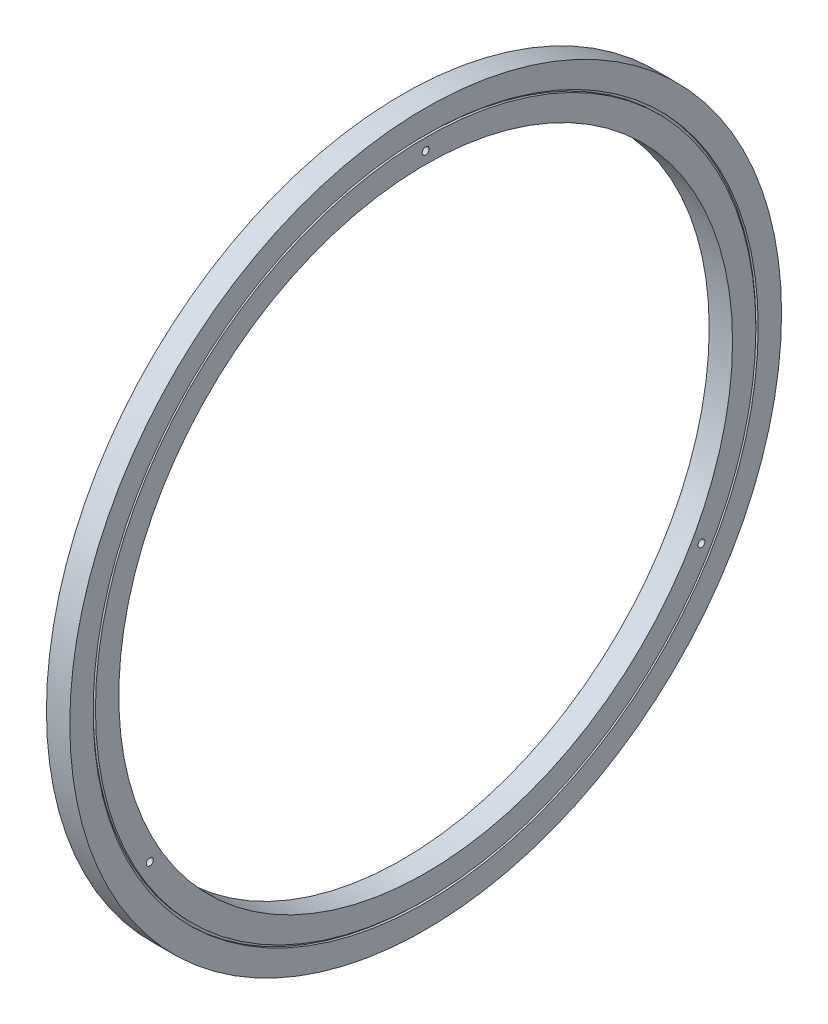
ISO-10303-21;
HEADER;
FILE_DESCRIPTION(('STEP AP214'),'2;1');
FILE_NAME('part.step','',(''),(''),'','','');
FILE_SCHEMA(('AUTOMOTIVE_DESIGN { 1 0 10303 214 1 1 1 1 }'));
ENDSEC;
DATA;
#1=APPLICATION_CONTEXT('core data for automotive mechanical design processes');
#2=APPLICATION_PROTOCOL_DEFINITION('international standard','automotive_design',2000,#1);
#3=PRODUCT_CONTEXT('',#1,'mechanical');
#4=PRODUCT('Part','Part','',(#3));
#5=PRODUCT_RELATED_PRODUCT_CATEGORY('part','',(#4));
#6=PRODUCT_DEFINITION_FORMATION('','',#4);
#7=PRODUCT_DEFINITION_CONTEXT('part definition',#1,'design');
#8=PRODUCT_DEFINITION('design','',#6,#7);
#9=PRODUCT_DEFINITION_SHAPE('','',#8);
#10=(LENGTH_UNIT() NAMED_UNIT(*) SI_UNIT(.MILLI.,.METRE.));
#11=(NAMED_UNIT(*) PLANE_ANGLE_UNIT() SI_UNIT($,.RADIAN.));
#12=(NAMED_UNIT(*) SI_UNIT($,.STERADIAN.) SOLID_ANGLE_UNIT());
#13=UNCERTAINTY_MEASURE_WITH_UNIT(LENGTH_MEASURE(1.E-05),#10,'distance_accuracy_value','');
#14=(GEOMETRIC_REPRESENTATION_CONTEXT(3) GLOBAL_UNCERTAINTY_ASSIGNED_CONTEXT((#13)) GLOBAL_UNIT_ASSIGNED_CONTEXT((#10,
#11,#12)) REPRESENTATION_CONTEXT('',''));
#15=CARTESIAN_POINT('',(0.,0.,0.));
#16=DIRECTION('',(0.,0.,1.));
#17=DIRECTION('',(1.,0.,0.));
#18=AXIS2_PLACEMENT_3D('',#15,#16,#17);
#19=CARTESIAN_POINT('',(5.,0.,0.));
#20=DIRECTION('',(-1.,0.,0.));
#21=DIRECTION('',(0.,0.,1.));
#22=AXIS2_PLACEMENT_3D('',#19,#20,#21);
#23=CYLINDRICAL_SURFACE('',#22,141.5);
#24=CARTESIAN_POINT('',(-5.,0.,0.));
#25=DIRECTION('',(1.,0.,0.));
#26=DIRECTION('',(0.,0.,-1.));
#27=AXIS2_PLACEMENT_3D('',#24,#25,#26);
#28=CIRCLE('',#27,141.5);
#29=CARTESIAN_POINT('',(-5.,0.,-141.5));
#30=VERTEX_POINT('',#29);
#31=EDGE_CURVE('E66',#30,#30,#28,.T.);
#32=ORIENTED_EDGE('',*,*,#31,.T.);
#33=EDGE_LOOP('',(#32));
#34=FACE_BOUND('',#33,.T.);
#35=CARTESIAN_POINT('',(-4.,0.,0.));
#36=DIRECTION('',(1.,0.,0.));
#37=DIRECTION('',(0.,0.,-1.));
#38=AXIS2_PLACEMENT_3D('',#35,#36,#37);
#39=CIRCLE('',#38,141.5);
#40=CARTESIAN_POINT('',(-4.,0.,-141.5));
#41=VERTEX_POINT('',#40);
#42=EDGE_CURVE('E11',#41,#41,#39,.T.);
#43=ORIENTED_EDGE('',*,*,#42,.F.);
#44=EDGE_LOOP('',(#43));
#45=FACE_BOUND('',#44,.T.);
#46=ADVANCED_FACE('F47',(#34,#45),#23,.T.);
#47=CARTESIAN_POINT('',(5.,0.,0.));
#48=DIRECTION('',(-1.,0.,0.));
#49=DIRECTION('',(0.,0.,1.));
#50=AXIS2_PLACEMENT_3D('',#47,#48,#49);
#51=CYLINDRICAL_SURFACE('',#50,131.5);
#52=CARTESIAN_POINT('',(5.,0.,0.));
#53=DIRECTION('',(1.,0.,0.));
#54=DIRECTION('',(0.,0.,-1.));
#55=AXIS2_PLACEMENT_3D('',#52,#53,#54);
#56=CIRCLE('',#55,131.5);
#57=CARTESIAN_POINT('',(5.,0.,-131.5));
#58=VERTEX_POINT('',#57);
#59=EDGE_CURVE('E60',#58,#58,#56,.T.);
#60=ORIENTED_EDGE('',*,*,#59,.T.);
#61=EDGE_LOOP('',(#60));
#62=FACE_BOUND('',#61,.T.);
#63=CARTESIAN_POINT('',(-5.,0.,0.));
#64=DIRECTION('',(1.,0.,0.));
#65=DIRECTION('',(0.,0.,-1.));
#66=AXIS2_PLACEMENT_3D('',#63,#64,#65);
#67=CIRCLE('',#66,131.5);
#68=CARTESIAN_POINT('',(-5.,0.,-131.5));
#69=VERTEX_POINT('',#68);
#70=EDGE_CURVE('E70',#69,#69,#67,.T.);
#71=ORIENTED_EDGE('',*,*,#70,.F.);
#72=EDGE_LOOP('',(#71));
#73=FACE_BOUND('',#72,.T.);
#74=ADVANCED_FACE('F49',(#62,#73),#51,.F.);
#75=CARTESIAN_POINT('',(4.,0.,0.));
#76=DIRECTION('',(1.,0.,0.));
#77=DIRECTION('',(0.,0.,-1.));
#78=AXIS2_PLACEMENT_3D('',#75,#76,#77);
#79=CIRCLE('',#78,141.5);
#80=CARTESIAN_POINT('',(4.,0.,-141.5));
#81=VERTEX_POINT('',#80);
#82=EDGE_CURVE('E73',#81,#81,#79,.T.);
#83=ORIENTED_EDGE('',*,*,#82,.T.);
#84=EDGE_LOOP('',(#83));
#85=FACE_BOUND('',#84,.T.);
#86=CARTESIAN_POINT('',(5.,0.,0.));
#87=DIRECTION('',(1.,0.,0.));
#88=DIRECTION('',(0.,0.,-1.));
#89=AXIS2_PLACEMENT_3D('',#86,#87,#88);
#90=CIRCLE('',#89,141.5);
#91=CARTESIAN_POINT('',(5.,0.,-141.5));
#92=VERTEX_POINT('',#91);
#93=EDGE_CURVE('E55',#92,#92,#90,.T.);
#94=ORIENTED_EDGE('',*,*,#93,.F.);
#95=EDGE_LOOP('',(#94));
#96=FACE_BOUND('',#95,.T.);
#97=ADVANCED_FACE('F93',(#85,#96),#23,.T.);
#98=CARTESIAN_POINT('',(5.,0.,0.));
#99=DIRECTION('',(1.,0.,0.));
#100=DIRECTION('',(0.,0.,-1.));
#101=AXIS2_PLACEMENT_3D('',#98,#99,#100);
#102=PLANE('',#101);
#103=CARTESIAN_POINT('',(5.,136.499999999995,-9.41439097620191E-12));
#104=DIRECTION('',(1.,0.,0.));
#105=DIRECTION('',(0.,0.,-1.));
#106=AXIS2_PLACEMENT_3D('',#103,#104,#105);
#107=CIRCLE('',#106,1.49999999999246);
#108=CARTESIAN_POINT('',(5.,136.499999999995,-1.50000000000187));
#109=VERTEX_POINT('',#108);
#110=EDGE_CURVE('E151',#109,#109,#107,.T.);
#111=ORIENTED_EDGE('',*,*,#110,.F.);
#112=EDGE_LOOP('',(#111));
#113=FACE_BOUND('',#112,.T.);
#114=CARTESIAN_POINT('',(5.,-68.2500000000005,-118.212467616576));
#115=DIRECTION('',(1.,0.,0.));
#116=DIRECTION('',(0.,0.,-1.));
#117=AXIS2_PLACEMENT_3D('',#114,#115,#116);
#118=CIRCLE('',#117,1.50000000000002);
#119=CARTESIAN_POINT('',(5.,-68.2500000000005,-119.712467616576));
#120=VERTEX_POINT('',#119);
#121=EDGE_CURVE('E143',#120,#120,#118,.T.);
#122=ORIENTED_EDGE('',*,*,#121,.F.);
#123=EDGE_LOOP('',(#122));
#124=FACE_BOUND('',#123,.T.);
#125=CARTESIAN_POINT('',(5.,-68.2499999999944,118.212467616568));
#126=DIRECTION('',(1.,0.,0.));
#127=DIRECTION('',(0.,0.,-1.));
#128=AXIS2_PLACEMENT_3D('',#125,#126,#127);
#129=CIRCLE('',#128,1.50000000000348);
#130=CARTESIAN_POINT('',(5.,-68.2499999999944,116.712467616564));
#131=VERTEX_POINT('',#130);
#132=EDGE_CURVE('E135',#131,#131,#129,.T.);
#133=ORIENTED_EDGE('',*,*,#132,.F.);
#134=EDGE_LOOP('',(#133));
#135=FACE_BOUND('',#134,.T.);
#136=ORIENTED_EDGE('',*,*,#59,.F.);
#137=EDGE_LOOP('',(#136));
#138=FACE_BOUND('',#137,.T.);
#139=ORIENTED_EDGE('',*,*,#93,.T.);
#140=EDGE_LOOP('',(#139));
#141=FACE_BOUND('',#140,.T.);
#142=ADVANCED_FACE('F83',(#113,#124,#135,#138,#141),#102,.T.);
#143=CARTESIAN_POINT('',(-5.,0.,0.));
#144=DIRECTION('',(1.,0.,0.));
#145=DIRECTION('',(0.,0.,-1.));
#146=AXIS2_PLACEMENT_3D('',#143,#144,#145);
#147=PLANE('',#146);
#148=ORIENTED_EDGE('',*,*,#70,.T.);
#149=EDGE_LOOP('',(#148));
#150=FACE_BOUND('',#149,.T.);
#151=ORIENTED_EDGE('',*,*,#31,.F.);
#152=EDGE_LOOP('',(#151));
#153=FACE_BOUND('',#152,.T.);
#154=ADVANCED_FACE('F80',(#150,#153),#147,.F.);
#155=CARTESIAN_POINT('',(4.,0.,0.));
#156=DIRECTION('',(1.,0.,0.));
#157=DIRECTION('',(0.,0.,-1.));
#158=AXIS2_PLACEMENT_3D('',#155,#156,#157);
#159=PLANE('',#158);
#160=ORIENTED_EDGE('',*,*,#82,.F.);
#161=EDGE_LOOP('',(#160));
#162=FACE_BOUND('',#161,.T.);
#163=CARTESIAN_POINT('',(4.,0.,0.));
#164=DIRECTION('',(1.,0.,0.));
#165=DIRECTION('',(0.,0.,-1.));
#166=AXIS2_PLACEMENT_3D('',#163,#164,#165);
#167=CIRCLE('',#166,142.5);
#168=CARTESIAN_POINT('',(4.,0.,-142.5));
#169=VERTEX_POINT('',#168);
#170=EDGE_CURVE('E113',#169,#169,#167,.F.);
#171=ORIENTED_EDGE('',*,*,#170,.F.);
#172=EDGE_LOOP('',(#171));
#173=FACE_BOUND('',#172,.T.);
#174=ADVANCED_FACE('F82',(#162,#173),#159,.T.);
#175=CARTESIAN_POINT('',(-4.,0.,0.));
#176=DIRECTION('',(1.,0.,0.));
#177=DIRECTION('',(0.,0.,-1.));
#178=AXIS2_PLACEMENT_3D('',#175,#176,#177);
#179=PLANE('',#178);
#180=ORIENTED_EDGE('',*,*,#42,.T.);
#181=EDGE_LOOP('',(#180));
#182=FACE_BOUND('',#181,.T.);
#183=CARTESIAN_POINT('',(-4.,0.,0.));
#184=DIRECTION('',(1.,0.,0.));
#185=DIRECTION('',(0.,0.,-1.));
#186=AXIS2_PLACEMENT_3D('',#183,#184,#185);
#187=CIRCLE('',#186,142.5);
#188=CARTESIAN_POINT('',(-4.,0.,-142.5));
#189=VERTEX_POINT('',#188);
#190=EDGE_CURVE('E109',#189,#189,#187,.T.);
#191=ORIENTED_EDGE('',*,*,#190,.F.);
#192=EDGE_LOOP('',(#191));
#193=FACE_BOUND('',#192,.T.);
#194=ADVANCED_FACE('F90',(#182,#193),#179,.F.);
#195=CARTESIAN_POINT('',(5.,0.,0.));
#196=DIRECTION('',(-1.,0.,0.));
#197=DIRECTION('',(0.,0.,1.));
#198=AXIS2_PLACEMENT_3D('',#195,#196,#197);
#199=CYLINDRICAL_SURFACE('',#198,142.5);
#200=CARTESIAN_POINT('',(-5.,0.,0.));
#201=DIRECTION('',(1.,0.,0.));
#202=DIRECTION('',(0.,0.,-1.));
#203=AXIS2_PLACEMENT_3D('',#200,#201,#202);
#204=CIRCLE('',#203,142.5);
#205=CARTESIAN_POINT('',(-5.,0.,-142.5));
#206=VERTEX_POINT('',#205);
#207=EDGE_CURVE('E124',#206,#206,#204,.T.);
#208=ORIENTED_EDGE('',*,*,#207,.F.);
#209=EDGE_LOOP('',(#208));
#210=FACE_BOUND('',#209,.T.);
#211=ORIENTED_EDGE('',*,*,#190,.T.);
#212=EDGE_LOOP('',(#211));
#213=FACE_BOUND('',#212,.T.);
#214=ADVANCED_FACE('F204',(#210,#213),#199,.F.);
#215=ORIENTED_EDGE('',*,*,#170,.T.);
#216=EDGE_LOOP('',(#215));
#217=FACE_BOUND('',#216,.T.);
#218=CARTESIAN_POINT('',(5.,0.,0.));
#219=DIRECTION('',(1.,0.,0.));
#220=DIRECTION('',(0.,0.,-1.));
#221=AXIS2_PLACEMENT_3D('',#218,#219,#220);
#222=CIRCLE('',#221,142.5);
#223=CARTESIAN_POINT('',(5.,0.,-142.5));
#224=VERTEX_POINT('',#223);
#225=EDGE_CURVE('E123',#224,#224,#222,.T.);
#226=ORIENTED_EDGE('',*,*,#225,.T.);
#227=EDGE_LOOP('',(#226));
#228=FACE_BOUND('',#227,.T.);
#229=ADVANCED_FACE('F201',(#217,#228),#199,.F.);
#230=CARTESIAN_POINT('',(5.,0.,0.));
#231=DIRECTION('',(-1.,0.,0.));
#232=DIRECTION('',(0.,0.,1.));
#233=AXIS2_PLACEMENT_3D('',#230,#231,#232);
#234=CYLINDRICAL_SURFACE('',#233,152.5);
#235=CARTESIAN_POINT('',(5.,0.,0.));
#236=DIRECTION('',(1.,0.,0.));
#237=DIRECTION('',(0.,0.,-1.));
#238=AXIS2_PLACEMENT_3D('',#235,#236,#237);
#239=CIRCLE('',#238,152.5);
#240=CARTESIAN_POINT('',(5.,0.,-152.5));
#241=VERTEX_POINT('',#240);
#242=EDGE_CURVE('E118',#241,#241,#239,.T.);
#243=ORIENTED_EDGE('',*,*,#242,.F.);
#244=EDGE_LOOP('',(#243));
#245=FACE_BOUND('',#244,.T.);
#246=CARTESIAN_POINT('',(-5.,0.,0.));
#247=DIRECTION('',(1.,0.,0.));
#248=DIRECTION('',(0.,0.,-1.));
#249=AXIS2_PLACEMENT_3D('',#246,#247,#248);
#250=CIRCLE('',#249,152.5);
#251=CARTESIAN_POINT('',(-5.,0.,-152.5));
#252=VERTEX_POINT('',#251);
#253=EDGE_CURVE('E119',#252,#252,#250,.T.);
#254=ORIENTED_EDGE('',*,*,#253,.T.);
#255=EDGE_LOOP('',(#254));
#256=FACE_BOUND('',#255,.T.);
#257=ADVANCED_FACE('F196',(#245,#256),#234,.T.);
#258=CARTESIAN_POINT('',(5.,0.,0.));
#259=DIRECTION('',(1.,0.,0.));
#260=DIRECTION('',(0.,0.,-1.));
#261=AXIS2_PLACEMENT_3D('',#258,#259,#260);
#262=PLANE('',#261);
#263=ORIENTED_EDGE('',*,*,#225,.F.);
#264=EDGE_LOOP('',(#263));
#265=FACE_BOUND('',#264,.T.);
#266=ORIENTED_EDGE('',*,*,#242,.T.);
#267=EDGE_LOOP('',(#266));
#268=FACE_BOUND('',#267,.T.);
#269=ADVANCED_FACE('F189',(#265,#268),#262,.T.);
#270=CARTESIAN_POINT('',(-5.,0.,0.));
#271=DIRECTION('',(1.,0.,0.));
#272=DIRECTION('',(0.,0.,-1.));
#273=AXIS2_PLACEMENT_3D('',#270,#271,#272);
#274=PLANE('',#273);
#275=ORIENTED_EDGE('',*,*,#207,.T.);
#276=EDGE_LOOP('',(#275));
#277=FACE_BOUND('',#276,.T.);
#278=ORIENTED_EDGE('',*,*,#253,.F.);
#279=EDGE_LOOP('',(#278));
#280=FACE_BOUND('',#279,.T.);
#281=ADVANCED_FACE('F179',(#277,#280),#274,.F.);
#282=CARTESIAN_POINT('',(1.,-68.2499999999944,118.212467616568));
#283=DIRECTION('',(1.,0.,0.));
#284=DIRECTION('',(0.,0.,-1.));
#285=AXIS2_PLACEMENT_3D('',#282,#283,#284);
#286=CYLINDRICAL_SURFACE('',#285,1.50000000000348);
#287=CARTESIAN_POINT('',(1.,-68.2499999999944,118.212467616568));
#288=DIRECTION('',(1.,0.,0.));
#289=DIRECTION('',(0.,0.,-1.));
#290=AXIS2_PLACEMENT_3D('',#287,#288,#289);
#291=CIRCLE('',#290,1.50000000000348);
#292=CARTESIAN_POINT('',(1.,-68.2499999999944,116.712467616564));
#293=VERTEX_POINT('',#292);
#294=EDGE_CURVE('E139',#293,#293,#291,.T.);
#295=ORIENTED_EDGE('',*,*,#294,.F.);
#296=EDGE_LOOP('',(#295));
#297=FACE_BOUND('',#296,.T.);
#298=ORIENTED_EDGE('',*,*,#132,.T.);
#299=EDGE_LOOP('',(#298));
#300=FACE_BOUND('',#299,.T.);
#301=ADVANCED_FACE('F176',(#297,#300),#286,.F.);
#302=CARTESIAN_POINT('',(1.,0.,0.));
#303=DIRECTION('',(1.,0.,0.));
#304=DIRECTION('',(0.,0.,-1.));
#305=AXIS2_PLACEMENT_3D('',#302,#303,#304);
#306=PLANE('',#305);
#307=ORIENTED_EDGE('',*,*,#294,.T.);
#308=EDGE_LOOP('',(#307));
#309=FACE_BOUND('',#308,.T.);
#310=ADVANCED_FACE('F178',(#309),#306,.T.);
#311=CARTESIAN_POINT('',(1.,-68.2500000000005,-118.212467616576));
#312=DIRECTION('',(1.,0.,0.));
#313=DIRECTION('',(0.,0.,-1.));
#314=AXIS2_PLACEMENT_3D('',#311,#312,#313);
#315=CYLINDRICAL_SURFACE('',#314,1.50000000000002);
#316=CARTESIAN_POINT('',(1.,-68.2500000000005,-118.212467616576));
#317=DIRECTION('',(1.,0.,0.));
#318=DIRECTION('',(0.,0.,-1.));
#319=AXIS2_PLACEMENT_3D('',#316,#317,#318);
#320=CIRCLE('',#319,1.50000000000002);
#321=CARTESIAN_POINT('',(1.,-68.2500000000005,-119.712467616576));
#322=VERTEX_POINT('',#321);
#323=EDGE_CURVE('E147',#322,#322,#320,.T.);
#324=ORIENTED_EDGE('',*,*,#323,.F.);
#325=EDGE_LOOP('',(#324));
#326=FACE_BOUND('',#325,.T.);
#327=ORIENTED_EDGE('',*,*,#121,.T.);
#328=EDGE_LOOP('',(#327));
#329=FACE_BOUND('',#328,.T.);
#330=ADVANCED_FACE('F186',(#326,#329),#315,.F.);
#331=CARTESIAN_POINT('',(1.,0.,0.));
#332=DIRECTION('',(1.,0.,0.));
#333=DIRECTION('',(0.,0.,-1.));
#334=AXIS2_PLACEMENT_3D('',#331,#332,#333);
#335=PLANE('',#334);
#336=ORIENTED_EDGE('',*,*,#323,.T.);
#337=EDGE_LOOP('',(#336));
#338=FACE_BOUND('',#337,.T.);
#339=ADVANCED_FACE('F164',(#338),#335,.T.);
#340=CARTESIAN_POINT('',(1.,136.499999999995,-9.41439097620191E-12));
#341=DIRECTION('',(1.,0.,0.));
#342=DIRECTION('',(0.,0.,-1.));
#343=AXIS2_PLACEMENT_3D('',#340,#341,#342);
#344=CYLINDRICAL_SURFACE('',#343,1.49999999999246);
#345=CARTESIAN_POINT('',(1.,136.499999999995,-9.41439097620191E-12));
#346=DIRECTION('',(1.,0.,0.));
#347=DIRECTION('',(0.,0.,-1.));
#348=AXIS2_PLACEMENT_3D('',#345,#346,#347);
#349=CIRCLE('',#348,1.49999999999246);
#350=CARTESIAN_POINT('',(1.,136.499999999995,-1.50000000000187));
#351=VERTEX_POINT('',#350);
#352=EDGE_CURVE('E128',#351,#351,#349,.T.);
#353=ORIENTED_EDGE('',*,*,#352,.F.);
#354=EDGE_LOOP('',(#353));
#355=FACE_BOUND('',#354,.T.);
#356=ORIENTED_EDGE('',*,*,#110,.T.);
#357=EDGE_LOOP('',(#356));
#358=FACE_BOUND('',#357,.T.);
#359=ADVANCED_FACE('F161',(#355,#358),#344,.F.);
#360=CARTESIAN_POINT('',(1.,0.,0.));
#361=DIRECTION('',(1.,0.,0.));
#362=DIRECTION('',(0.,0.,-1.));
#363=AXIS2_PLACEMENT_3D('',#360,#361,#362);
#364=PLANE('',#363);
#365=ORIENTED_EDGE('',*,*,#352,.T.);
#366=EDGE_LOOP('',(#365));
#367=FACE_BOUND('',#366,.T.);
#368=ADVANCED_FACE('F159',(#367),#364,.T.);
#369=CLOSED_SHELL('',(#46,#74,#97,#142,#154,#174,#194,#214,#229,#257,#269,#281,#301,#310,#330,
#339,#359,#368));
#370=MANIFOLD_SOLID_BREP('B2',#369);
#371=ADVANCED_BREP_SHAPE_REPRESENTATION('',(#18,#370),#14);
#372=SHAPE_DEFINITION_REPRESENTATION(#9,#371);
ENDSEC;
END-ISO-10303-21;
